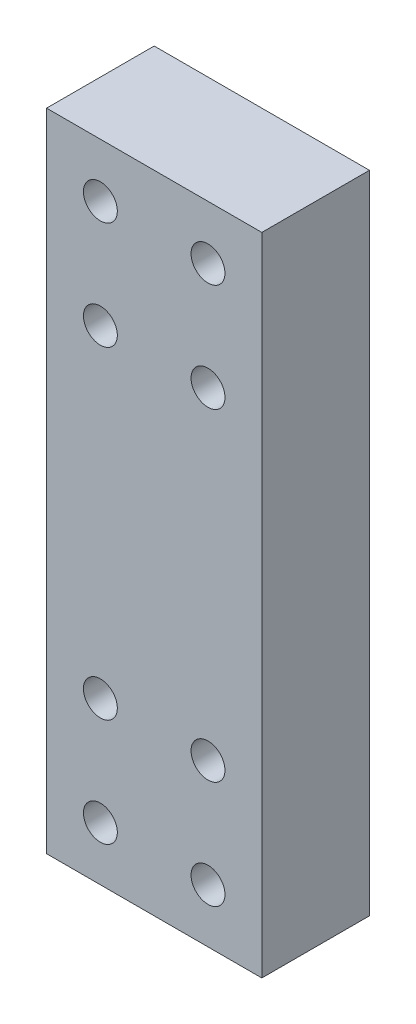
ISO-10303-21;
HEADER;
FILE_DESCRIPTION(('STEP AP214'),'2;1');
FILE_NAME('part.step','',(''),(''),'','','');
FILE_SCHEMA(('AUTOMOTIVE_DESIGN { 1 0 10303 214 1 1 1 1 }'));
ENDSEC;
DATA;
#1=APPLICATION_CONTEXT('core data for automotive mechanical design processes');
#2=APPLICATION_PROTOCOL_DEFINITION('international standard','automotive_design',2000,#1);
#3=PRODUCT_CONTEXT('',#1,'mechanical');
#4=PRODUCT('Part','Part','',(#3));
#5=PRODUCT_RELATED_PRODUCT_CATEGORY('part','',(#4));
#6=PRODUCT_DEFINITION_FORMATION('','',#4);
#7=PRODUCT_DEFINITION_CONTEXT('part definition',#1,'design');
#8=PRODUCT_DEFINITION('design','',#6,#7);
#9=PRODUCT_DEFINITION_SHAPE('','',#8);
#10=(LENGTH_UNIT() NAMED_UNIT(*) SI_UNIT(.MILLI.,.METRE.));
#11=(NAMED_UNIT(*) PLANE_ANGLE_UNIT() SI_UNIT($,.RADIAN.));
#12=(NAMED_UNIT(*) SI_UNIT($,.STERADIAN.) SOLID_ANGLE_UNIT());
#13=UNCERTAINTY_MEASURE_WITH_UNIT(LENGTH_MEASURE(1.E-05),#10,'distance_accuracy_value','');
#14=(GEOMETRIC_REPRESENTATION_CONTEXT(3) GLOBAL_UNCERTAINTY_ASSIGNED_CONTEXT((#13)) GLOBAL_UNIT_ASSIGNED_CONTEXT((#10,
#11,#12)) REPRESENTATION_CONTEXT('',''));
#15=CARTESIAN_POINT('',(0.,0.,0.));
#16=DIRECTION('',(0.,0.,1.));
#17=DIRECTION('',(1.,0.,0.));
#18=AXIS2_PLACEMENT_3D('',#15,#16,#17);
#19=CARTESIAN_POINT('',(0.,0.,10.));
#20=DIRECTION('',(1.,0.,0.));
#21=DIRECTION('',(0.,1.,0.));
#22=AXIS2_PLACEMENT_3D('',#19,#20,#21);
#23=PLANE('',#22);
#24=DIRECTION('',(0.,-1.,0.));
#25=VECTOR('',#24,1.);
#26=CARTESIAN_POINT('',(0.,0.,0.));
#27=LINE('',#26,#25);
#28=CARTESIAN_POINT('',(0.,0.,0.));
#29=VERTEX_POINT('',#28);
#30=CARTESIAN_POINT('',(0.,-60.,0.));
#31=VERTEX_POINT('',#30);
#32=EDGE_CURVE('E110',#29,#31,#27,.T.);
#33=ORIENTED_EDGE('',*,*,#32,.T.);
#34=DIRECTION('',(0.,0.,-1.));
#35=VECTOR('',#34,1.);
#36=CARTESIAN_POINT('',(0.,-60.,10.));
#37=LINE('',#36,#35);
#38=CARTESIAN_POINT('',(0.,-60.,10.));
#39=VERTEX_POINT('',#38);
#40=EDGE_CURVE('E11',#39,#31,#37,.T.);
#41=ORIENTED_EDGE('',*,*,#40,.F.);
#42=DIRECTION('',(0.,-1.,0.));
#43=VECTOR('',#42,1.);
#44=CARTESIAN_POINT('',(0.,0.,10.));
#45=LINE('',#44,#43);
#46=CARTESIAN_POINT('',(0.,0.,10.));
#47=VERTEX_POINT('',#46);
#48=EDGE_CURVE('E94',#47,#39,#45,.T.);
#49=ORIENTED_EDGE('',*,*,#48,.F.);
#50=DIRECTION('',(0.,0.,-1.));
#51=VECTOR('',#50,1.);
#52=CARTESIAN_POINT('',(0.,0.,10.));
#53=LINE('',#52,#51);
#54=EDGE_CURVE('E106',#47,#29,#53,.T.);
#55=ORIENTED_EDGE('',*,*,#54,.T.);
#56=EDGE_LOOP('',(#33,#41,#49,#55));
#57=FACE_BOUND('',#56,.T.);
#58=ADVANCED_FACE('F42',(#57),#23,.F.);
#59=CARTESIAN_POINT('',(0.,-60.,10.));
#60=DIRECTION('',(0.,1.,0.));
#61=DIRECTION('',(0.,0.,1.));
#62=AXIS2_PLACEMENT_3D('',#59,#60,#61);
#63=PLANE('',#62);
#64=DIRECTION('',(1.,0.,0.));
#65=VECTOR('',#64,1.);
#66=CARTESIAN_POINT('',(0.,-60.,0.));
#67=LINE('',#66,#65);
#68=CARTESIAN_POINT('',(20.,-60.,0.));
#69=VERTEX_POINT('',#68);
#70=EDGE_CURVE('E99',#31,#69,#67,.T.);
#71=ORIENTED_EDGE('',*,*,#70,.T.);
#72=DIRECTION('',(0.,0.,-1.));
#73=VECTOR('',#72,1.);
#74=CARTESIAN_POINT('',(20.,-60.,10.));
#75=LINE('',#74,#73);
#76=CARTESIAN_POINT('',(20.,-60.,10.));
#77=VERTEX_POINT('',#76);
#78=EDGE_CURVE('E51',#77,#69,#75,.T.);
#79=ORIENTED_EDGE('',*,*,#78,.F.);
#80=DIRECTION('',(1.,0.,0.));
#81=VECTOR('',#80,1.);
#82=CARTESIAN_POINT('',(0.,-60.,10.));
#83=LINE('',#82,#81);
#84=EDGE_CURVE('E89',#39,#77,#83,.T.);
#85=ORIENTED_EDGE('',*,*,#84,.F.);
#86=ORIENTED_EDGE('',*,*,#40,.T.);
#87=EDGE_LOOP('',(#71,#79,#85,#86));
#88=FACE_BOUND('',#87,.T.);
#89=ADVANCED_FACE('F98',(#88),#63,.F.);
#90=CARTESIAN_POINT('',(20.,0.,10.));
#91=DIRECTION('',(-1.,0.,0.));
#92=DIRECTION('',(0.,-1.,0.));
#93=AXIS2_PLACEMENT_3D('',#90,#91,#92);
#94=PLANE('',#93);
#95=DIRECTION('',(0.,1.,0.));
#96=VECTOR('',#95,1.);
#97=CARTESIAN_POINT('',(20.,0.,0.));
#98=LINE('',#97,#96);
#99=CARTESIAN_POINT('',(20.,0.,0.));
#100=VERTEX_POINT('',#99);
#101=EDGE_CURVE('E76',#69,#100,#98,.T.);
#102=ORIENTED_EDGE('',*,*,#101,.T.);
#103=DIRECTION('',(0.,0.,-1.));
#104=VECTOR('',#103,1.);
#105=CARTESIAN_POINT('',(20.,0.,10.));
#106=LINE('',#105,#104);
#107=CARTESIAN_POINT('',(20.,0.,10.));
#108=VERTEX_POINT('',#107);
#109=EDGE_CURVE('E101',#108,#100,#106,.T.);
#110=ORIENTED_EDGE('',*,*,#109,.F.);
#111=DIRECTION('',(0.,1.,0.));
#112=VECTOR('',#111,1.);
#113=CARTESIAN_POINT('',(20.,0.,10.));
#114=LINE('',#113,#112);
#115=EDGE_CURVE('E92',#77,#108,#114,.T.);
#116=ORIENTED_EDGE('',*,*,#115,.F.);
#117=ORIENTED_EDGE('',*,*,#78,.T.);
#118=EDGE_LOOP('',(#102,#110,#116,#117));
#119=FACE_BOUND('',#118,.T.);
#120=ADVANCED_FACE('F102',(#119),#94,.F.);
#121=CARTESIAN_POINT('',(0.,0.,10.));
#122=DIRECTION('',(0.,-1.,0.));
#123=DIRECTION('',(0.,0.,-1.));
#124=AXIS2_PLACEMENT_3D('',#121,#122,#123);
#125=PLANE('',#124);
#126=DIRECTION('',(-1.,0.,0.));
#127=VECTOR('',#126,1.);
#128=CARTESIAN_POINT('',(0.,0.,0.));
#129=LINE('',#128,#127);
#130=EDGE_CURVE('E82',#100,#29,#129,.T.);
#131=ORIENTED_EDGE('',*,*,#130,.T.);
#132=ORIENTED_EDGE('',*,*,#54,.F.);
#133=DIRECTION('',(-1.,0.,0.));
#134=VECTOR('',#133,1.);
#135=CARTESIAN_POINT('',(0.,0.,10.));
#136=LINE('',#135,#134);
#137=EDGE_CURVE('E59',#108,#47,#136,.T.);
#138=ORIENTED_EDGE('',*,*,#137,.F.);
#139=ORIENTED_EDGE('',*,*,#109,.T.);
#140=EDGE_LOOP('',(#131,#132,#138,#139));
#141=FACE_BOUND('',#140,.T.);
#142=ADVANCED_FACE('F124',(#141),#125,.F.);
#143=CARTESIAN_POINT('',(0.,0.,10.));
#144=DIRECTION('',(0.,0.,1.));
#145=DIRECTION('',(1.,0.,0.));
#146=AXIS2_PLACEMENT_3D('',#143,#144,#145);
#147=PLANE('',#146);
#148=CARTESIAN_POINT('',(15.,-5.,10.));
#149=DIRECTION('',(0.,0.,1.));
#150=DIRECTION('',(-1.,0.,0.));
#151=AXIS2_PLACEMENT_3D('',#148,#149,#150);
#152=CIRCLE('',#151,1.575);
#153=CARTESIAN_POINT('',(13.425,-5.,10.));
#154=VERTEX_POINT('',#153);
#155=EDGE_CURVE('E135',#154,#154,#152,.T.);
#156=ORIENTED_EDGE('',*,*,#155,.F.);
#157=EDGE_LOOP('',(#156));
#158=FACE_BOUND('',#157,.T.);
#159=CARTESIAN_POINT('',(15.,-15.,10.));
#160=DIRECTION('',(0.,0.,1.));
#161=DIRECTION('',(1.,0.,0.));
#162=AXIS2_PLACEMENT_3D('',#159,#160,#161);
#163=CIRCLE('',#162,1.575);
#164=CARTESIAN_POINT('',(16.575,-15.,10.));
#165=VERTEX_POINT('',#164);
#166=EDGE_CURVE('E160',#165,#165,#163,.T.);
#167=ORIENTED_EDGE('',*,*,#166,.F.);
#168=EDGE_LOOP('',(#167));
#169=FACE_BOUND('',#168,.T.);
#170=CARTESIAN_POINT('',(5.,-15.,10.));
#171=DIRECTION('',(0.,0.,1.));
#172=DIRECTION('',(-1.,0.,0.));
#173=AXIS2_PLACEMENT_3D('',#170,#171,#172);
#174=CIRCLE('',#173,1.575);
#175=CARTESIAN_POINT('',(3.425,-15.,10.));
#176=VERTEX_POINT('',#175);
#177=EDGE_CURVE('E152',#176,#176,#174,.T.);
#178=ORIENTED_EDGE('',*,*,#177,.F.);
#179=EDGE_LOOP('',(#178));
#180=FACE_BOUND('',#179,.T.);
#181=CARTESIAN_POINT('',(5.,-45.,10.));
#182=DIRECTION('',(0.,0.,1.));
#183=DIRECTION('',(1.,0.,0.));
#184=AXIS2_PLACEMENT_3D('',#181,#182,#183);
#185=CIRCLE('',#184,1.575);
#186=CARTESIAN_POINT('',(6.575,-45.,10.));
#187=VERTEX_POINT('',#186);
#188=EDGE_CURVE('E143',#187,#187,#185,.T.);
#189=ORIENTED_EDGE('',*,*,#188,.F.);
#190=EDGE_LOOP('',(#189));
#191=FACE_BOUND('',#190,.T.);
#192=CARTESIAN_POINT('',(15.,-45.,10.));
#193=DIRECTION('',(0.,0.,1.));
#194=DIRECTION('',(-1.,0.,0.));
#195=AXIS2_PLACEMENT_3D('',#192,#193,#194);
#196=CIRCLE('',#195,1.575);
#197=CARTESIAN_POINT('',(13.425,-45.,10.));
#198=VERTEX_POINT('',#197);
#199=EDGE_CURVE('E144',#198,#198,#196,.T.);
#200=ORIENTED_EDGE('',*,*,#199,.F.);
#201=EDGE_LOOP('',(#200));
#202=FACE_BOUND('',#201,.T.);
#203=CARTESIAN_POINT('',(15.,-55.,10.));
#204=DIRECTION('',(0.,0.,1.));
#205=DIRECTION('',(1.,0.,0.));
#206=AXIS2_PLACEMENT_3D('',#203,#204,#205);
#207=CIRCLE('',#206,1.575);
#208=CARTESIAN_POINT('',(16.575,-55.,10.));
#209=VERTEX_POINT('',#208);
#210=EDGE_CURVE('E183',#209,#209,#207,.T.);
#211=ORIENTED_EDGE('',*,*,#210,.F.);
#212=EDGE_LOOP('',(#211));
#213=FACE_BOUND('',#212,.T.);
#214=CARTESIAN_POINT('',(5.,-55.,10.));
#215=DIRECTION('',(0.,0.,1.));
#216=DIRECTION('',(-1.,0.,0.));
#217=AXIS2_PLACEMENT_3D('',#214,#215,#216);
#218=CIRCLE('',#217,1.575);
#219=CARTESIAN_POINT('',(3.425,-55.,10.));
#220=VERTEX_POINT('',#219);
#221=EDGE_CURVE('E175',#220,#220,#218,.T.);
#222=ORIENTED_EDGE('',*,*,#221,.F.);
#223=EDGE_LOOP('',(#222));
#224=FACE_BOUND('',#223,.T.);
#225=CARTESIAN_POINT('',(5.,-5.,10.));
#226=DIRECTION('',(0.,0.,1.));
#227=DIRECTION('',(1.,0.,0.));
#228=AXIS2_PLACEMENT_3D('',#225,#226,#227);
#229=CIRCLE('',#228,1.575);
#230=CARTESIAN_POINT('',(6.575,-5.,10.));
#231=VERTEX_POINT('',#230);
#232=EDGE_CURVE('E131',#231,#231,#229,.T.);
#233=ORIENTED_EDGE('',*,*,#232,.F.);
#234=EDGE_LOOP('',(#233));
#235=FACE_BOUND('',#234,.T.);
#236=ORIENTED_EDGE('',*,*,#48,.T.);
#237=ORIENTED_EDGE('',*,*,#84,.T.);
#238=ORIENTED_EDGE('',*,*,#115,.T.);
#239=ORIENTED_EDGE('',*,*,#137,.T.);
#240=EDGE_LOOP('',(#236,#237,#238,#239));
#241=FACE_BOUND('',#240,.T.);
#242=ADVANCED_FACE('F90',(#158,#169,#180,#191,#202,#213,#224,#235,#241),#147,.T.);
#243=CARTESIAN_POINT('',(0.,0.,0.));
#244=DIRECTION('',(0.,0.,1.));
#245=DIRECTION('',(1.,0.,0.));
#246=AXIS2_PLACEMENT_3D('',#243,#244,#245);
#247=PLANE('',#246);
#248=CARTESIAN_POINT('',(15.,-5.,0.));
#249=DIRECTION('',(0.,0.,1.));
#250=DIRECTION('',(-1.,0.,0.));
#251=AXIS2_PLACEMENT_3D('',#248,#249,#250);
#252=CIRCLE('',#251,1.575);
#253=CARTESIAN_POINT('',(13.425,-5.,0.));
#254=VERTEX_POINT('',#253);
#255=EDGE_CURVE('E164',#254,#254,#252,.T.);
#256=ORIENTED_EDGE('',*,*,#255,.T.);
#257=EDGE_LOOP('',(#256));
#258=FACE_BOUND('',#257,.T.);
#259=CARTESIAN_POINT('',(15.,-15.,0.));
#260=DIRECTION('',(0.,0.,1.));
#261=DIRECTION('',(1.,0.,0.));
#262=AXIS2_PLACEMENT_3D('',#259,#260,#261);
#263=CIRCLE('',#262,1.575);
#264=CARTESIAN_POINT('',(16.575,-15.,0.));
#265=VERTEX_POINT('',#264);
#266=EDGE_CURVE('E156',#265,#265,#263,.T.);
#267=ORIENTED_EDGE('',*,*,#266,.T.);
#268=EDGE_LOOP('',(#267));
#269=FACE_BOUND('',#268,.T.);
#270=CARTESIAN_POINT('',(5.,-15.,0.));
#271=DIRECTION('',(0.,0.,1.));
#272=DIRECTION('',(-1.,0.,0.));
#273=AXIS2_PLACEMENT_3D('',#270,#271,#272);
#274=CIRCLE('',#273,1.575);
#275=CARTESIAN_POINT('',(3.425,-15.,0.));
#276=VERTEX_POINT('',#275);
#277=EDGE_CURVE('E148',#276,#276,#274,.T.);
#278=ORIENTED_EDGE('',*,*,#277,.T.);
#279=EDGE_LOOP('',(#278));
#280=FACE_BOUND('',#279,.T.);
#281=CARTESIAN_POINT('',(5.,-45.,0.));
#282=DIRECTION('',(0.,0.,1.));
#283=DIRECTION('',(1.,0.,0.));
#284=AXIS2_PLACEMENT_3D('',#281,#282,#283);
#285=CIRCLE('',#284,1.575);
#286=CARTESIAN_POINT('',(6.575,-45.,0.));
#287=VERTEX_POINT('',#286);
#288=EDGE_CURVE('E139',#287,#287,#285,.T.);
#289=ORIENTED_EDGE('',*,*,#288,.T.);
#290=EDGE_LOOP('',(#289));
#291=FACE_BOUND('',#290,.T.);
#292=CARTESIAN_POINT('',(15.,-45.,0.));
#293=DIRECTION('',(0.,0.,1.));
#294=DIRECTION('',(-1.,0.,0.));
#295=AXIS2_PLACEMENT_3D('',#292,#293,#294);
#296=CIRCLE('',#295,1.575);
#297=CARTESIAN_POINT('',(13.425,-45.,0.));
#298=VERTEX_POINT('',#297);
#299=EDGE_CURVE('E187',#298,#298,#296,.T.);
#300=ORIENTED_EDGE('',*,*,#299,.T.);
#301=EDGE_LOOP('',(#300));
#302=FACE_BOUND('',#301,.T.);
#303=CARTESIAN_POINT('',(15.,-55.,0.));
#304=DIRECTION('',(0.,0.,1.));
#305=DIRECTION('',(1.,0.,0.));
#306=AXIS2_PLACEMENT_3D('',#303,#304,#305);
#307=CIRCLE('',#306,1.575);
#308=CARTESIAN_POINT('',(16.575,-55.,0.));
#309=VERTEX_POINT('',#308);
#310=EDGE_CURVE('E179',#309,#309,#307,.T.);
#311=ORIENTED_EDGE('',*,*,#310,.T.);
#312=EDGE_LOOP('',(#311));
#313=FACE_BOUND('',#312,.T.);
#314=CARTESIAN_POINT('',(5.,-55.,0.));
#315=DIRECTION('',(0.,0.,1.));
#316=DIRECTION('',(-1.,0.,0.));
#317=AXIS2_PLACEMENT_3D('',#314,#315,#316);
#318=CIRCLE('',#317,1.575);
#319=CARTESIAN_POINT('',(3.425,-55.,0.));
#320=VERTEX_POINT('',#319);
#321=EDGE_CURVE('E171',#320,#320,#318,.T.);
#322=ORIENTED_EDGE('',*,*,#321,.T.);
#323=EDGE_LOOP('',(#322));
#324=FACE_BOUND('',#323,.T.);
#325=CARTESIAN_POINT('',(5.,-5.,0.));
#326=DIRECTION('',(0.,0.,1.));
#327=DIRECTION('',(1.,0.,0.));
#328=AXIS2_PLACEMENT_3D('',#325,#326,#327);
#329=CIRCLE('',#328,1.575);
#330=CARTESIAN_POINT('',(6.575,-5.,0.));
#331=VERTEX_POINT('',#330);
#332=EDGE_CURVE('E114',#331,#331,#329,.T.);
#333=ORIENTED_EDGE('',*,*,#332,.T.);
#334=EDGE_LOOP('',(#333));
#335=FACE_BOUND('',#334,.T.);
#336=ORIENTED_EDGE('',*,*,#32,.F.);
#337=ORIENTED_EDGE('',*,*,#130,.F.);
#338=ORIENTED_EDGE('',*,*,#101,.F.);
#339=ORIENTED_EDGE('',*,*,#70,.F.);
#340=EDGE_LOOP('',(#336,#337,#338,#339));
#341=FACE_BOUND('',#340,.T.);
#342=ADVANCED_FACE('F127',(#258,#269,#280,#291,#302,#313,#324,#335,#341),#247,.F.);
#343=CARTESIAN_POINT('',(5.,-5.,0.));
#344=DIRECTION('',(0.,0.,1.));
#345=DIRECTION('',(1.,0.,0.));
#346=AXIS2_PLACEMENT_3D('',#343,#344,#345);
#347=CYLINDRICAL_SURFACE('',#346,1.575);
#348=ORIENTED_EDGE('',*,*,#332,.F.);
#349=EDGE_LOOP('',(#348));
#350=FACE_BOUND('',#349,.T.);
#351=ORIENTED_EDGE('',*,*,#232,.T.);
#352=EDGE_LOOP('',(#351));
#353=FACE_BOUND('',#352,.T.);
#354=ADVANCED_FACE('F207',(#350,#353),#347,.F.);
#355=CARTESIAN_POINT('',(5.,-55.,0.));
#356=DIRECTION('',(0.,0.,1.));
#357=DIRECTION('',(1.,0.,0.));
#358=AXIS2_PLACEMENT_3D('',#355,#356,#357);
#359=CYLINDRICAL_SURFACE('',#358,1.575);
#360=ORIENTED_EDGE('',*,*,#321,.F.);
#361=EDGE_LOOP('',(#360));
#362=FACE_BOUND('',#361,.T.);
#363=ORIENTED_EDGE('',*,*,#221,.T.);
#364=EDGE_LOOP('',(#363));
#365=FACE_BOUND('',#364,.T.);
#366=ADVANCED_FACE('F209',(#362,#365),#359,.F.);
#367=CARTESIAN_POINT('',(15.,-55.,0.));
#368=DIRECTION('',(0.,0.,1.));
#369=DIRECTION('',(1.,0.,0.));
#370=AXIS2_PLACEMENT_3D('',#367,#368,#369);
#371=CYLINDRICAL_SURFACE('',#370,1.575);
#372=ORIENTED_EDGE('',*,*,#310,.F.);
#373=EDGE_LOOP('',(#372));
#374=FACE_BOUND('',#373,.T.);
#375=ORIENTED_EDGE('',*,*,#210,.T.);
#376=EDGE_LOOP('',(#375));
#377=FACE_BOUND('',#376,.T.);
#378=ADVANCED_FACE('F216',(#374,#377),#371,.F.);
#379=CARTESIAN_POINT('',(15.,-45.,0.));
#380=DIRECTION('',(0.,0.,1.));
#381=DIRECTION('',(1.,0.,0.));
#382=AXIS2_PLACEMENT_3D('',#379,#380,#381);
#383=CYLINDRICAL_SURFACE('',#382,1.575);
#384=ORIENTED_EDGE('',*,*,#299,.F.);
#385=EDGE_LOOP('',(#384));
#386=FACE_BOUND('',#385,.T.);
#387=ORIENTED_EDGE('',*,*,#199,.T.);
#388=EDGE_LOOP('',(#387));
#389=FACE_BOUND('',#388,.T.);
#390=ADVANCED_FACE('F195',(#386,#389),#383,.F.);
#391=CARTESIAN_POINT('',(5.,-45.,0.));
#392=DIRECTION('',(0.,0.,1.));
#393=DIRECTION('',(1.,0.,0.));
#394=AXIS2_PLACEMENT_3D('',#391,#392,#393);
#395=CYLINDRICAL_SURFACE('',#394,1.575);
#396=ORIENTED_EDGE('',*,*,#288,.F.);
#397=EDGE_LOOP('',(#396));
#398=FACE_BOUND('',#397,.T.);
#399=ORIENTED_EDGE('',*,*,#188,.T.);
#400=EDGE_LOOP('',(#399));
#401=FACE_BOUND('',#400,.T.);
#402=ADVANCED_FACE('F277',(#398,#401),#395,.F.);
#403=CARTESIAN_POINT('',(5.,-15.,0.));
#404=DIRECTION('',(0.,0.,1.));
#405=DIRECTION('',(1.,0.,0.));
#406=AXIS2_PLACEMENT_3D('',#403,#404,#405);
#407=CYLINDRICAL_SURFACE('',#406,1.575);
#408=ORIENTED_EDGE('',*,*,#277,.F.);
#409=EDGE_LOOP('',(#408));
#410=FACE_BOUND('',#409,.T.);
#411=ORIENTED_EDGE('',*,*,#177,.T.);
#412=EDGE_LOOP('',(#411));
#413=FACE_BOUND('',#412,.T.);
#414=ADVANCED_FACE('F288',(#410,#413),#407,.F.);
#415=CARTESIAN_POINT('',(15.,-15.,0.));
#416=DIRECTION('',(0.,0.,1.));
#417=DIRECTION('',(1.,0.,0.));
#418=AXIS2_PLACEMENT_3D('',#415,#416,#417);
#419=CYLINDRICAL_SURFACE('',#418,1.575);
#420=ORIENTED_EDGE('',*,*,#266,.F.);
#421=EDGE_LOOP('',(#420));
#422=FACE_BOUND('',#421,.T.);
#423=ORIENTED_EDGE('',*,*,#166,.T.);
#424=EDGE_LOOP('',(#423));
#425=FACE_BOUND('',#424,.T.);
#426=ADVANCED_FACE('F298',(#422,#425),#419,.F.);
#427=CARTESIAN_POINT('',(15.,-5.,0.));
#428=DIRECTION('',(0.,0.,1.));
#429=DIRECTION('',(1.,0.,0.));
#430=AXIS2_PLACEMENT_3D('',#427,#428,#429);
#431=CYLINDRICAL_SURFACE('',#430,1.575);
#432=ORIENTED_EDGE('',*,*,#255,.F.);
#433=EDGE_LOOP('',(#432));
#434=FACE_BOUND('',#433,.T.);
#435=ORIENTED_EDGE('',*,*,#155,.T.);
#436=EDGE_LOOP('',(#435));
#437=FACE_BOUND('',#436,.T.);
#438=ADVANCED_FACE('F309',(#434,#437),#431,.F.);
#439=CLOSED_SHELL('',(#58,#89,#120,#142,#242,#342,#354,#366,#378,#390,#402,#414,#426,#438));
#440=MANIFOLD_SOLID_BREP('B2',#439);
#441=ADVANCED_BREP_SHAPE_REPRESENTATION('',(#18,#440),#14);
#442=SHAPE_DEFINITION_REPRESENTATION(#9,#441);
ENDSEC;
END-ISO-10303-21;
